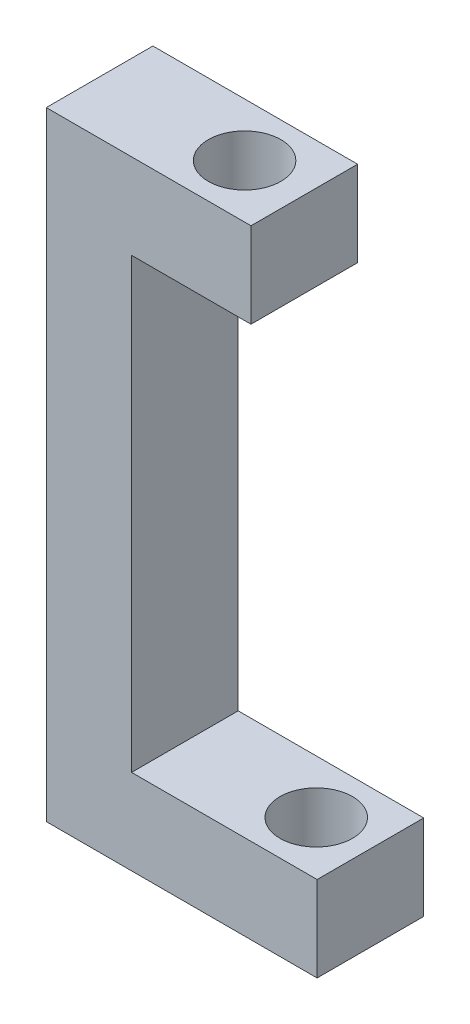
ISO-10303-21;
HEADER;
FILE_DESCRIPTION(('STEP AP214'),'2;1');
FILE_NAME('part.step','',(''),(''),'','','');
FILE_SCHEMA(('AUTOMOTIVE_DESIGN { 1 0 10303 214 1 1 1 1 }'));
ENDSEC;
DATA;
#1=APPLICATION_CONTEXT('core data for automotive mechanical design processes');
#2=APPLICATION_PROTOCOL_DEFINITION('international standard','automotive_design',2000,#1);
#3=PRODUCT_CONTEXT('',#1,'mechanical');
#4=PRODUCT('Part','Part','',(#3));
#5=PRODUCT_RELATED_PRODUCT_CATEGORY('part','',(#4));
#6=PRODUCT_DEFINITION_FORMATION('','',#4);
#7=PRODUCT_DEFINITION_CONTEXT('part definition',#1,'design');
#8=PRODUCT_DEFINITION('design','',#6,#7);
#9=PRODUCT_DEFINITION_SHAPE('','',#8);
#10=(LENGTH_UNIT() NAMED_UNIT(*) SI_UNIT(.MILLI.,.METRE.));
#11=(NAMED_UNIT(*) PLANE_ANGLE_UNIT() SI_UNIT($,.RADIAN.));
#12=(NAMED_UNIT(*) SI_UNIT($,.STERADIAN.) SOLID_ANGLE_UNIT());
#13=UNCERTAINTY_MEASURE_WITH_UNIT(LENGTH_MEASURE(1.E-05),#10,'distance_accuracy_value','');
#14=(GEOMETRIC_REPRESENTATION_CONTEXT(3) GLOBAL_UNCERTAINTY_ASSIGNED_CONTEXT((#13)) GLOBAL_UNIT_ASSIGNED_CONTEXT((#10,
#11,#12)) REPRESENTATION_CONTEXT('',''));
#15=CARTESIAN_POINT('',(0.,0.,0.));
#16=DIRECTION('',(0.,0.,1.));
#17=DIRECTION('',(1.,0.,0.));
#18=AXIS2_PLACEMENT_3D('',#15,#16,#17);
#19=CARTESIAN_POINT('',(12.7,-25.,5.));
#20=DIRECTION('',(-1.,0.,0.));
#21=DIRECTION('',(0.,-1.,0.));
#22=AXIS2_PLACEMENT_3D('',#19,#20,#21);
#23=PLANE('',#22);
#24=DIRECTION('',(0.,1.,0.));
#25=VECTOR('',#24,1.);
#26=CARTESIAN_POINT('',(12.7,-25.,0.));
#27=LINE('',#26,#25);
#28=CARTESIAN_POINT('',(12.7,-29.,0.));
#29=VERTEX_POINT('',#28);
#30=CARTESIAN_POINT('',(12.7,-25.,0.));
#31=VERTEX_POINT('',#30);
#32=EDGE_CURVE('E140',#29,#31,#27,.T.);
#33=ORIENTED_EDGE('',*,*,#32,.T.);
#34=DIRECTION('',(0.,0.,-1.));
#35=VECTOR('',#34,1.);
#36=CARTESIAN_POINT('',(12.7,-25.,5.));
#37=LINE('',#36,#35);
#38=CARTESIAN_POINT('',(12.7,-25.,5.));
#39=VERTEX_POINT('',#38);
#40=EDGE_CURVE('E11',#39,#31,#37,.T.);
#41=ORIENTED_EDGE('',*,*,#40,.F.);
#42=DIRECTION('',(0.,1.,0.));
#43=VECTOR('',#42,1.);
#44=CARTESIAN_POINT('',(12.7,-25.,5.));
#45=LINE('',#44,#43);
#46=CARTESIAN_POINT('',(12.7,-29.,5.));
#47=VERTEX_POINT('',#46);
#48=EDGE_CURVE('E163',#47,#39,#45,.T.);
#49=ORIENTED_EDGE('',*,*,#48,.F.);
#50=DIRECTION('',(0.,0.,-1.));
#51=VECTOR('',#50,1.);
#52=CARTESIAN_POINT('',(12.7,-29.,5.));
#53=LINE('',#52,#51);
#54=EDGE_CURVE('E136',#47,#29,#53,.T.);
#55=ORIENTED_EDGE('',*,*,#54,.T.);
#56=EDGE_LOOP('',(#33,#41,#49,#55));
#57=FACE_BOUND('',#56,.T.);
#58=ADVANCED_FACE('F39',(#57),#23,.F.);
#59=CARTESIAN_POINT('',(4.,-25.,5.));
#60=DIRECTION('',(0.,-1.,0.));
#61=DIRECTION('',(0.,0.,-1.));
#62=AXIS2_PLACEMENT_3D('',#59,#60,#61);
#63=PLANE('',#62);
#64=CARTESIAN_POINT('',(10.1599999999999,-25.,2.5));
#65=DIRECTION('',(0.,1.,0.));
#66=DIRECTION('',(0.,0.,1.));
#67=AXIS2_PLACEMENT_3D('',#64,#65,#66);
#68=CIRCLE('',#67,1.7);
#69=CARTESIAN_POINT('',(10.1599999999999,-25.,4.2));
#70=VERTEX_POINT('',#69);
#71=EDGE_CURVE('E210',#70,#70,#68,.T.);
#72=ORIENTED_EDGE('',*,*,#71,.F.);
#73=EDGE_LOOP('',(#72));
#74=FACE_BOUND('',#73,.T.);
#75=DIRECTION('',(-1.,0.,0.));
#76=VECTOR('',#75,1.);
#77=CARTESIAN_POINT('',(4.,-25.,0.));
#78=LINE('',#77,#76);
#79=CARTESIAN_POINT('',(4.,-25.,0.));
#80=VERTEX_POINT('',#79);
#81=EDGE_CURVE('E144',#31,#80,#78,.T.);
#82=ORIENTED_EDGE('',*,*,#81,.T.);
#83=DIRECTION('',(0.,0.,-1.));
#84=VECTOR('',#83,1.);
#85=CARTESIAN_POINT('',(4.,-25.,5.));
#86=LINE('',#85,#84);
#87=CARTESIAN_POINT('',(4.,-25.,5.));
#88=VERTEX_POINT('',#87);
#89=EDGE_CURVE('E48',#88,#80,#86,.T.);
#90=ORIENTED_EDGE('',*,*,#89,.F.);
#91=DIRECTION('',(-1.,0.,0.));
#92=VECTOR('',#91,1.);
#93=CARTESIAN_POINT('',(4.,-25.,5.));
#94=LINE('',#93,#92);
#95=EDGE_CURVE('E99',#39,#88,#94,.T.);
#96=ORIENTED_EDGE('',*,*,#95,.F.);
#97=ORIENTED_EDGE('',*,*,#40,.T.);
#98=EDGE_LOOP('',(#82,#90,#96,#97));
#99=FACE_BOUND('',#98,.T.);
#100=ADVANCED_FACE('F236',(#74,#99),#63,.F.);
#101=CARTESIAN_POINT('',(4.,-4.,5.));
#102=DIRECTION('',(-1.,0.,0.));
#103=DIRECTION('',(0.,-1.,0.));
#104=AXIS2_PLACEMENT_3D('',#101,#102,#103);
#105=PLANE('',#104);
#106=DIRECTION('',(0.,1.,0.));
#107=VECTOR('',#106,1.);
#108=CARTESIAN_POINT('',(4.,-4.,0.));
#109=LINE('',#108,#107);
#110=CARTESIAN_POINT('',(4.,-4.,0.));
#111=VERTEX_POINT('',#110);
#112=EDGE_CURVE('E148',#80,#111,#109,.T.);
#113=ORIENTED_EDGE('',*,*,#112,.T.);
#114=DIRECTION('',(0.,0.,-1.));
#115=VECTOR('',#114,1.);
#116=CARTESIAN_POINT('',(4.,-4.,5.));
#117=LINE('',#116,#115);
#118=CARTESIAN_POINT('',(4.,-4.,5.));
#119=VERTEX_POINT('',#118);
#120=EDGE_CURVE('E174',#119,#111,#117,.T.);
#121=ORIENTED_EDGE('',*,*,#120,.F.);
#122=DIRECTION('',(0.,1.,0.));
#123=VECTOR('',#122,1.);
#124=CARTESIAN_POINT('',(4.,-4.,5.));
#125=LINE('',#124,#123);
#126=EDGE_CURVE('E184',#88,#119,#125,.T.);
#127=ORIENTED_EDGE('',*,*,#126,.F.);
#128=ORIENTED_EDGE('',*,*,#89,.T.);
#129=EDGE_LOOP('',(#113,#121,#127,#128));
#130=FACE_BOUND('',#129,.T.);
#131=ADVANCED_FACE('F182',(#130),#105,.F.);
#132=CARTESIAN_POINT('',(9.6,-4.,5.));
#133=DIRECTION('',(0.,1.,0.));
#134=DIRECTION('',(0.,0.,1.));
#135=AXIS2_PLACEMENT_3D('',#132,#133,#134);
#136=PLANE('',#135);
#137=CARTESIAN_POINT('',(6.8,-4.,2.5));
#138=DIRECTION('',(0.,1.,0.));
#139=DIRECTION('',(0.,0.,1.));
#140=AXIS2_PLACEMENT_3D('',#137,#138,#139);
#141=CIRCLE('',#140,1.69999999999999);
#142=CARTESIAN_POINT('',(6.8,-4.,4.19999999999999));
#143=VERTEX_POINT('',#142);
#144=EDGE_CURVE('E214',#143,#143,#141,.T.);
#145=ORIENTED_EDGE('',*,*,#144,.T.);
#146=EDGE_LOOP('',(#145));
#147=FACE_BOUND('',#146,.T.);
#148=DIRECTION('',(1.,0.,0.));
#149=VECTOR('',#148,1.);
#150=CARTESIAN_POINT('',(9.6,-4.,0.));
#151=LINE('',#150,#149);
#152=CARTESIAN_POINT('',(9.6,-4.,0.));
#153=VERTEX_POINT('',#152);
#154=EDGE_CURVE('E151',#111,#153,#151,.T.);
#155=ORIENTED_EDGE('',*,*,#154,.T.);
#156=DIRECTION('',(0.,0.,-1.));
#157=VECTOR('',#156,1.);
#158=CARTESIAN_POINT('',(9.6,-4.,5.));
#159=LINE('',#158,#157);
#160=CARTESIAN_POINT('',(9.6,-4.,5.));
#161=VERTEX_POINT('',#160);
#162=EDGE_CURVE('E170',#161,#153,#159,.T.);
#163=ORIENTED_EDGE('',*,*,#162,.F.);
#164=DIRECTION('',(1.,0.,0.));
#165=VECTOR('',#164,1.);
#166=CARTESIAN_POINT('',(9.6,-4.,5.));
#167=LINE('',#166,#165);
#168=EDGE_CURVE('E197',#119,#161,#167,.T.);
#169=ORIENTED_EDGE('',*,*,#168,.F.);
#170=ORIENTED_EDGE('',*,*,#120,.T.);
#171=EDGE_LOOP('',(#155,#163,#169,#170));
#172=FACE_BOUND('',#171,.T.);
#173=ADVANCED_FACE('F192',(#147,#172),#136,.F.);
#174=CARTESIAN_POINT('',(9.6,0.,5.));
#175=DIRECTION('',(-1.,0.,0.));
#176=DIRECTION('',(0.,0.,1.));
#177=AXIS2_PLACEMENT_3D('',#174,#175,#176);
#178=PLANE('',#177);
#179=DIRECTION('',(0.,1.,0.));
#180=VECTOR('',#179,1.);
#181=CARTESIAN_POINT('',(9.6,0.,0.));
#182=LINE('',#181,#180);
#183=CARTESIAN_POINT('',(9.6,0.,0.));
#184=VERTEX_POINT('',#183);
#185=EDGE_CURVE('E154',#153,#184,#182,.T.);
#186=ORIENTED_EDGE('',*,*,#185,.T.);
#187=DIRECTION('',(0.,0.,-1.));
#188=VECTOR('',#187,1.);
#189=CARTESIAN_POINT('',(9.6,0.,5.));
#190=LINE('',#189,#188);
#191=CARTESIAN_POINT('',(9.6,0.,5.));
#192=VERTEX_POINT('',#191);
#193=EDGE_CURVE('E129',#192,#184,#190,.T.);
#194=ORIENTED_EDGE('',*,*,#193,.F.);
#195=DIRECTION('',(0.,1.,0.));
#196=VECTOR('',#195,1.);
#197=CARTESIAN_POINT('',(9.6,0.,5.));
#198=LINE('',#197,#196);
#199=EDGE_CURVE('E118',#161,#192,#198,.T.);
#200=ORIENTED_EDGE('',*,*,#199,.F.);
#201=ORIENTED_EDGE('',*,*,#162,.T.);
#202=EDGE_LOOP('',(#186,#194,#200,#201));
#203=FACE_BOUND('',#202,.T.);
#204=ADVANCED_FACE('F195',(#203),#178,.F.);
#205=CARTESIAN_POINT('',(0.,0.,5.));
#206=DIRECTION('',(0.,-1.,0.));
#207=DIRECTION('',(0.,0.,-1.));
#208=AXIS2_PLACEMENT_3D('',#205,#206,#207);
#209=PLANE('',#208);
#210=CARTESIAN_POINT('',(6.8,0.,2.5));
#211=DIRECTION('',(0.,1.,0.));
#212=DIRECTION('',(0.,0.,1.));
#213=AXIS2_PLACEMENT_3D('',#210,#211,#212);
#214=CIRCLE('',#213,1.69999999999999);
#215=CARTESIAN_POINT('',(6.8,0.,4.19999999999999));
#216=VERTEX_POINT('',#215);
#217=EDGE_CURVE('E218',#216,#216,#214,.T.);
#218=ORIENTED_EDGE('',*,*,#217,.F.);
#219=EDGE_LOOP('',(#218));
#220=FACE_BOUND('',#219,.T.);
#221=DIRECTION('',(-1.,0.,0.));
#222=VECTOR('',#221,1.);
#223=CARTESIAN_POINT('',(0.,0.,0.));
#224=LINE('',#223,#222);
#225=CARTESIAN_POINT('',(0.,0.,0.));
#226=VERTEX_POINT('',#225);
#227=EDGE_CURVE('E127',#184,#226,#224,.T.);
#228=ORIENTED_EDGE('',*,*,#227,.T.);
#229=DIRECTION('',(0.,0.,-1.));
#230=VECTOR('',#229,1.);
#231=CARTESIAN_POINT('',(0.,0.,5.));
#232=LINE('',#231,#230);
#233=CARTESIAN_POINT('',(0.,0.,5.));
#234=VERTEX_POINT('',#233);
#235=EDGE_CURVE('E124',#234,#226,#232,.T.);
#236=ORIENTED_EDGE('',*,*,#235,.F.);
#237=DIRECTION('',(-1.,0.,0.));
#238=VECTOR('',#237,1.);
#239=CARTESIAN_POINT('',(0.,0.,5.));
#240=LINE('',#239,#238);
#241=EDGE_CURVE('E112',#192,#234,#240,.T.);
#242=ORIENTED_EDGE('',*,*,#241,.F.);
#243=ORIENTED_EDGE('',*,*,#193,.T.);
#244=EDGE_LOOP('',(#228,#236,#242,#243));
#245=FACE_BOUND('',#244,.T.);
#246=ADVANCED_FACE('F125',(#220,#245),#209,.F.);
#247=CARTESIAN_POINT('',(0.,-29.,5.));
#248=DIRECTION('',(1.,0.,0.));
#249=DIRECTION('',(0.,1.,0.));
#250=AXIS2_PLACEMENT_3D('',#247,#248,#249);
#251=PLANE('',#250);
#252=DIRECTION('',(0.,-1.,0.));
#253=VECTOR('',#252,1.);
#254=CARTESIAN_POINT('',(0.,-29.,0.));
#255=LINE('',#254,#253);
#256=CARTESIAN_POINT('',(0.,-29.,0.));
#257=VERTEX_POINT('',#256);
#258=EDGE_CURVE('E85',#226,#257,#255,.T.);
#259=ORIENTED_EDGE('',*,*,#258,.T.);
#260=DIRECTION('',(0.,0.,-1.));
#261=VECTOR('',#260,1.);
#262=CARTESIAN_POINT('',(0.,-29.,5.));
#263=LINE('',#262,#261);
#264=CARTESIAN_POINT('',(0.,-29.,5.));
#265=VERTEX_POINT('',#264);
#266=EDGE_CURVE('E130',#265,#257,#263,.T.);
#267=ORIENTED_EDGE('',*,*,#266,.F.);
#268=DIRECTION('',(0.,-1.,0.));
#269=VECTOR('',#268,1.);
#270=CARTESIAN_POINT('',(0.,-29.,5.));
#271=LINE('',#270,#269);
#272=EDGE_CURVE('E116',#234,#265,#271,.T.);
#273=ORIENTED_EDGE('',*,*,#272,.F.);
#274=ORIENTED_EDGE('',*,*,#235,.T.);
#275=EDGE_LOOP('',(#259,#267,#273,#274));
#276=FACE_BOUND('',#275,.T.);
#277=ADVANCED_FACE('F132',(#276),#251,.F.);
#278=CARTESIAN_POINT('',(12.7,-29.,5.));
#279=DIRECTION('',(0.,1.,0.));
#280=DIRECTION('',(-1.,0.,0.));
#281=AXIS2_PLACEMENT_3D('',#278,#279,#280);
#282=PLANE('',#281);
#283=CARTESIAN_POINT('',(10.1599999999999,-29.,2.5));
#284=DIRECTION('',(0.,1.,0.));
#285=DIRECTION('',(0.,0.,1.));
#286=AXIS2_PLACEMENT_3D('',#283,#284,#285);
#287=CIRCLE('',#286,1.7);
#288=CARTESIAN_POINT('',(10.1599999999999,-29.,4.2));
#289=VERTEX_POINT('',#288);
#290=EDGE_CURVE('E145',#289,#289,#287,.T.);
#291=ORIENTED_EDGE('',*,*,#290,.T.);
#292=EDGE_LOOP('',(#291));
#293=FACE_BOUND('',#292,.T.);
#294=DIRECTION('',(1.,0.,0.));
#295=VECTOR('',#294,1.);
#296=CARTESIAN_POINT('',(12.7,-29.,0.));
#297=LINE('',#296,#295);
#298=EDGE_CURVE('E91',#257,#29,#297,.T.);
#299=ORIENTED_EDGE('',*,*,#298,.T.);
#300=ORIENTED_EDGE('',*,*,#54,.F.);
#301=DIRECTION('',(1.,0.,0.));
#302=VECTOR('',#301,1.);
#303=CARTESIAN_POINT('',(12.7,-29.,5.));
#304=LINE('',#303,#302);
#305=EDGE_CURVE('E56',#265,#47,#304,.T.);
#306=ORIENTED_EDGE('',*,*,#305,.F.);
#307=ORIENTED_EDGE('',*,*,#266,.T.);
#308=EDGE_LOOP('',(#299,#300,#306,#307));
#309=FACE_BOUND('',#308,.T.);
#310=ADVANCED_FACE('F232',(#293,#309),#282,.F.);
#311=CARTESIAN_POINT('',(0.,0.,5.));
#312=DIRECTION('',(0.,0.,-1.));
#313=DIRECTION('',(-1.,0.,0.));
#314=AXIS2_PLACEMENT_3D('',#311,#312,#313);
#315=PLANE('',#314);
#316=ORIENTED_EDGE('',*,*,#48,.T.);
#317=ORIENTED_EDGE('',*,*,#95,.T.);
#318=ORIENTED_EDGE('',*,*,#126,.T.);
#319=ORIENTED_EDGE('',*,*,#168,.T.);
#320=ORIENTED_EDGE('',*,*,#199,.T.);
#321=ORIENTED_EDGE('',*,*,#241,.T.);
#322=ORIENTED_EDGE('',*,*,#272,.T.);
#323=ORIENTED_EDGE('',*,*,#305,.T.);
#324=EDGE_LOOP('',(#316,#317,#318,#319,#320,#321,#322,#323));
#325=FACE_BOUND('',#324,.T.);
#326=ADVANCED_FACE('F114',(#325),#315,.F.);
#327=CARTESIAN_POINT('',(0.,0.,0.));
#328=DIRECTION('',(0.,0.,-1.));
#329=DIRECTION('',(-1.,0.,0.));
#330=AXIS2_PLACEMENT_3D('',#327,#328,#329);
#331=PLANE('',#330);
#332=ORIENTED_EDGE('',*,*,#32,.F.);
#333=ORIENTED_EDGE('',*,*,#298,.F.);
#334=ORIENTED_EDGE('',*,*,#258,.F.);
#335=ORIENTED_EDGE('',*,*,#227,.F.);
#336=ORIENTED_EDGE('',*,*,#185,.F.);
#337=ORIENTED_EDGE('',*,*,#154,.F.);
#338=ORIENTED_EDGE('',*,*,#112,.F.);
#339=ORIENTED_EDGE('',*,*,#81,.F.);
#340=EDGE_LOOP('',(#332,#333,#334,#335,#336,#337,#338,#339));
#341=FACE_BOUND('',#340,.T.);
#342=ADVANCED_FACE('F188',(#341),#331,.T.);
#343=CARTESIAN_POINT('',(10.1599999999999,-25.,2.5));
#344=DIRECTION('',(0.,1.,0.));
#345=DIRECTION('',(0.,0.,1.));
#346=AXIS2_PLACEMENT_3D('',#343,#344,#345);
#347=CYLINDRICAL_SURFACE('',#346,1.7);
#348=ORIENTED_EDGE('',*,*,#290,.F.);
#349=EDGE_LOOP('',(#348));
#350=FACE_BOUND('',#349,.T.);
#351=ORIENTED_EDGE('',*,*,#71,.T.);
#352=EDGE_LOOP('',(#351));
#353=FACE_BOUND('',#352,.T.);
#354=ADVANCED_FACE('F253',(#350,#353),#347,.F.);
#355=CARTESIAN_POINT('',(6.8,0.,2.5));
#356=DIRECTION('',(0.,1.,0.));
#357=DIRECTION('',(0.,0.,1.));
#358=AXIS2_PLACEMENT_3D('',#355,#356,#357);
#359=CYLINDRICAL_SURFACE('',#358,1.69999999999999);
#360=ORIENTED_EDGE('',*,*,#217,.T.);
#361=EDGE_LOOP('',(#360));
#362=FACE_BOUND('',#361,.T.);
#363=ORIENTED_EDGE('',*,*,#144,.F.);
#364=EDGE_LOOP('',(#363));
#365=FACE_BOUND('',#364,.T.);
#366=ADVANCED_FACE('F223',(#362,#365),#359,.F.);
#367=CLOSED_SHELL('',(#58,#100,#131,#173,#204,#246,#277,#310,#326,#342,#354,#366));
#368=MANIFOLD_SOLID_BREP('B2',#367);
#369=ADVANCED_BREP_SHAPE_REPRESENTATION('',(#18,#368),#14);
#370=SHAPE_DEFINITION_REPRESENTATION(#9,#369);
ENDSEC;
END-ISO-10303-21;
